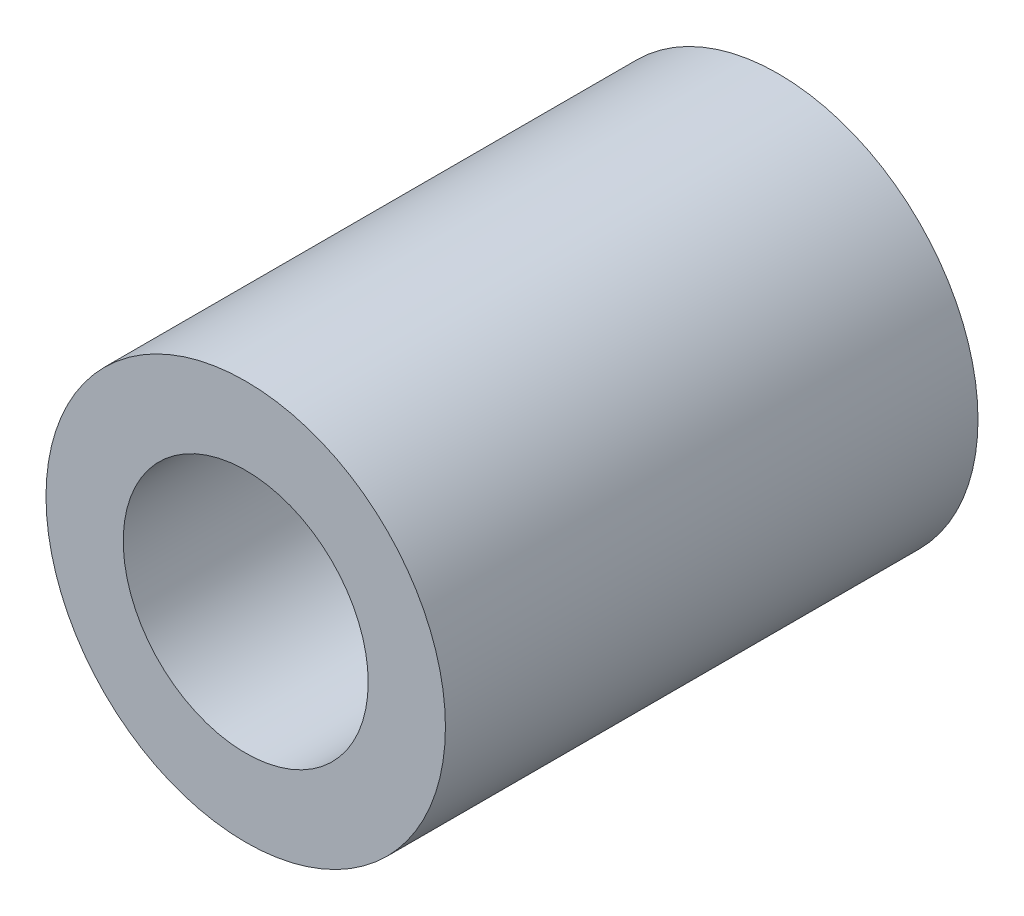
ISO-10303-21;
HEADER;
FILE_DESCRIPTION(('STEP AP214'),'2;1');
FILE_NAME('part.step','',(''),(''),'','','');
FILE_SCHEMA(('AUTOMOTIVE_DESIGN { 1 0 10303 214 1 1 1 1 }'));
ENDSEC;
DATA;
#1=APPLICATION_CONTEXT('core data for automotive mechanical design processes');
#2=APPLICATION_PROTOCOL_DEFINITION('international standard','automotive_design',2000,#1);
#3=PRODUCT_CONTEXT('',#1,'mechanical');
#4=PRODUCT('Part','Part','',(#3));
#5=PRODUCT_RELATED_PRODUCT_CATEGORY('part','',(#4));
#6=PRODUCT_DEFINITION_FORMATION('','',#4);
#7=PRODUCT_DEFINITION_CONTEXT('part definition',#1,'design');
#8=PRODUCT_DEFINITION('design','',#6,#7);
#9=PRODUCT_DEFINITION_SHAPE('','',#8);
#10=(LENGTH_UNIT() NAMED_UNIT(*) SI_UNIT(.MILLI.,.METRE.));
#11=(NAMED_UNIT(*) PLANE_ANGLE_UNIT() SI_UNIT($,.RADIAN.));
#12=(NAMED_UNIT(*) SI_UNIT($,.STERADIAN.) SOLID_ANGLE_UNIT());
#13=UNCERTAINTY_MEASURE_WITH_UNIT(LENGTH_MEASURE(1.E-05),#10,'distance_accuracy_value','');
#14=(GEOMETRIC_REPRESENTATION_CONTEXT(3) GLOBAL_UNCERTAINTY_ASSIGNED_CONTEXT((#13)) GLOBAL_UNIT_ASSIGNED_CONTEXT((#10,
#11,#12)) REPRESENTATION_CONTEXT('',''));
#15=CARTESIAN_POINT('',(0.,0.,0.));
#16=DIRECTION('',(0.,0.,1.));
#17=DIRECTION('',(1.,0.,0.));
#18=AXIS2_PLACEMENT_3D('',#15,#16,#17);
#19=CARTESIAN_POINT('',(0.,0.,3.175));
#20=DIRECTION('',(0.,0.,1.));
#21=DIRECTION('',(1.,0.,0.));
#22=AXIS2_PLACEMENT_3D('',#19,#20,#21);
#23=PLANE('',#22);
#24=CARTESIAN_POINT('',(0.,0.,3.175));
#25=DIRECTION('',(0.,0.,1.));
#26=DIRECTION('',(1.,0.,0.));
#27=AXIS2_PLACEMENT_3D('',#24,#25,#26);
#28=CIRCLE('',#27,2.38125);
#29=CARTESIAN_POINT('',(2.38125,0.,3.175));
#30=VERTEX_POINT('',#29);
#31=EDGE_CURVE('E10',#30,#30,#28,.T.);
#32=ORIENTED_EDGE('',*,*,#31,.T.);
#33=EDGE_LOOP('',(#32));
#34=FACE_BOUND('',#33,.T.);
#35=CARTESIAN_POINT('',(0.,0.,3.175));
#36=DIRECTION('',(0.,0.,1.));
#37=DIRECTION('',(1.,0.,0.));
#38=AXIS2_PLACEMENT_3D('',#35,#36,#37);
#39=CIRCLE('',#38,1.4605);
#40=CARTESIAN_POINT('',(1.4605,0.,3.175));
#41=VERTEX_POINT('',#40);
#42=EDGE_CURVE('E37',#41,#41,#39,.T.);
#43=ORIENTED_EDGE('',*,*,#42,.F.);
#44=EDGE_LOOP('',(#43));
#45=FACE_BOUND('',#44,.T.);
#46=ADVANCED_FACE('F30',(#34,#45),#23,.T.);
#47=CARTESIAN_POINT('',(0.,0.,3.175));
#48=DIRECTION('',(0.,0.,-1.));
#49=DIRECTION('',(-1.,0.,0.));
#50=AXIS2_PLACEMENT_3D('',#47,#48,#49);
#51=CYLINDRICAL_SURFACE('',#50,2.38125);
#52=ORIENTED_EDGE('',*,*,#31,.F.);
#53=EDGE_LOOP('',(#52));
#54=FACE_BOUND('',#53,.T.);
#55=CARTESIAN_POINT('',(0.,0.,-3.175));
#56=DIRECTION('',(0.,0.,1.));
#57=DIRECTION('',(1.,0.,0.));
#58=AXIS2_PLACEMENT_3D('',#55,#56,#57);
#59=CIRCLE('',#58,2.38125);
#60=CARTESIAN_POINT('',(2.38125,0.,-3.175));
#61=VERTEX_POINT('',#60);
#62=EDGE_CURVE('E41',#61,#61,#59,.T.);
#63=ORIENTED_EDGE('',*,*,#62,.T.);
#64=EDGE_LOOP('',(#63));
#65=FACE_BOUND('',#64,.T.);
#66=ADVANCED_FACE('F32',(#54,#65),#51,.T.);
#67=CARTESIAN_POINT('',(0.,0.,3.175));
#68=DIRECTION('',(0.,0.,-1.));
#69=DIRECTION('',(-1.,0.,0.));
#70=AXIS2_PLACEMENT_3D('',#67,#68,#69);
#71=CYLINDRICAL_SURFACE('',#70,1.4605);
#72=ORIENTED_EDGE('',*,*,#42,.T.);
#73=EDGE_LOOP('',(#72));
#74=FACE_BOUND('',#73,.T.);
#75=CARTESIAN_POINT('',(0.,0.,-3.175));
#76=DIRECTION('',(0.,0.,1.));
#77=DIRECTION('',(1.,0.,0.));
#78=AXIS2_PLACEMENT_3D('',#75,#76,#77);
#79=CIRCLE('',#78,1.4605);
#80=CARTESIAN_POINT('',(1.4605,0.,-3.175));
#81=VERTEX_POINT('',#80);
#82=EDGE_CURVE('E45',#81,#81,#79,.T.);
#83=ORIENTED_EDGE('',*,*,#82,.F.);
#84=EDGE_LOOP('',(#83));
#85=FACE_BOUND('',#84,.T.);
#86=ADVANCED_FACE('F54',(#74,#85),#71,.F.);
#87=CARTESIAN_POINT('',(0.,0.,-3.175));
#88=DIRECTION('',(0.,0.,1.));
#89=DIRECTION('',(1.,0.,0.));
#90=AXIS2_PLACEMENT_3D('',#87,#88,#89);
#91=PLANE('',#90);
#92=ORIENTED_EDGE('',*,*,#82,.T.);
#93=EDGE_LOOP('',(#92));
#94=FACE_BOUND('',#93,.T.);
#95=ORIENTED_EDGE('',*,*,#62,.F.);
#96=EDGE_LOOP('',(#95));
#97=FACE_BOUND('',#96,.T.);
#98=ADVANCED_FACE('F51',(#94,#97),#91,.F.);
#99=CLOSED_SHELL('',(#46,#66,#86,#98));
#100=MANIFOLD_SOLID_BREP('B2',#99);
#101=ADVANCED_BREP_SHAPE_REPRESENTATION('',(#18,#100),#14);
#102=SHAPE_DEFINITION_REPRESENTATION(#9,#101);
ENDSEC;
END-ISO-10303-21;
